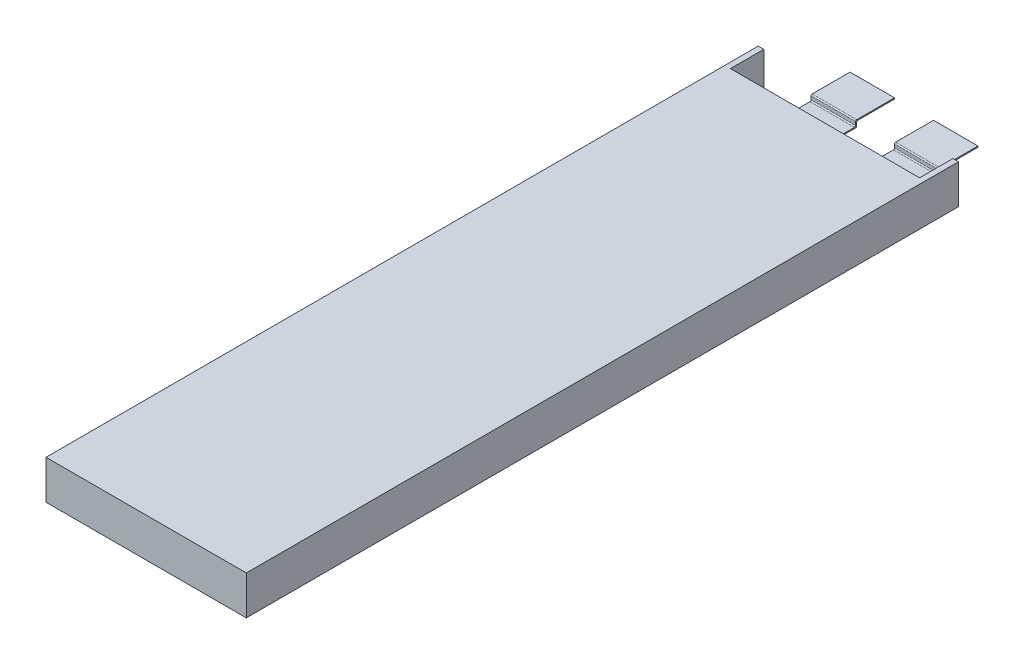
ISO-10303-21;
HEADER;
FILE_DESCRIPTION(('STEP AP214'),'2;1');
FILE_NAME('part.step','',(''),(''),'','','');
FILE_SCHEMA(('AUTOMOTIVE_DESIGN { 1 0 10303 214 1 1 1 1 }'));
ENDSEC;
DATA;
#1=APPLICATION_CONTEXT('core data for automotive mechanical design processes');
#2=APPLICATION_PROTOCOL_DEFINITION('international standard','automotive_design',2000,#1);
#3=PRODUCT_CONTEXT('',#1,'mechanical');
#4=PRODUCT('Part','Part','',(#3));
#5=PRODUCT_RELATED_PRODUCT_CATEGORY('part','',(#4));
#6=PRODUCT_DEFINITION_FORMATION('','',#4);
#7=PRODUCT_DEFINITION_CONTEXT('part definition',#1,'design');
#8=PRODUCT_DEFINITION('design','',#6,#7);
#9=PRODUCT_DEFINITION_SHAPE('','',#8);
#10=(LENGTH_UNIT() NAMED_UNIT(*) SI_UNIT(.MILLI.,.METRE.));
#11=(NAMED_UNIT(*) PLANE_ANGLE_UNIT() SI_UNIT($,.RADIAN.));
#12=(NAMED_UNIT(*) SI_UNIT($,.STERADIAN.) SOLID_ANGLE_UNIT());
#13=UNCERTAINTY_MEASURE_WITH_UNIT(LENGTH_MEASURE(1.E-05),#10,'distance_accuracy_value','');
#14=(GEOMETRIC_REPRESENTATION_CONTEXT(3) GLOBAL_UNCERTAINTY_ASSIGNED_CONTEXT((#13)) GLOBAL_UNIT_ASSIGNED_CONTEXT((#10,
#11,#12)) REPRESENTATION_CONTEXT('',''));
#15=CARTESIAN_POINT('',(0.,0.,0.));
#16=DIRECTION('',(0.,0.,1.));
#17=DIRECTION('',(1.,0.,0.));
#18=AXIS2_PLACEMENT_3D('',#15,#16,#17);
#19=CARTESIAN_POINT('',(0.,1.,0.));
#20=DIRECTION('',(0.,-1.,0.));
#21=DIRECTION('',(0.,0.,-1.));
#22=AXIS2_PLACEMENT_3D('',#19,#20,#21);
#23=PLANE('',#22);
#24=DIRECTION('',(-1.,0.,0.));
#25=VECTOR('',#24,1.);
#26=CARTESIAN_POINT('',(18.,1.,-58.));
#27=LINE('',#26,#25);
#28=CARTESIAN_POINT('',(17.,1.,-58.));
#29=VERTEX_POINT('',#28);
#30=CARTESIAN_POINT('',(-17.,1.,-58.));
#31=VERTEX_POINT('',#30);
#32=EDGE_CURVE('E527',#29,#31,#27,.T.);
#33=ORIENTED_EDGE('',*,*,#32,.F.);
#34=DIRECTION('',(0.,0.,-1.));
#35=VECTOR('',#34,1.);
#36=CARTESIAN_POINT('',(17.,1.,-64.));
#37=LINE('',#36,#35);
#38=CARTESIAN_POINT('',(17.,1.,-64.));
#39=VERTEX_POINT('',#38);
#40=EDGE_CURVE('E260',#29,#39,#37,.T.);
#41=ORIENTED_EDGE('',*,*,#40,.T.);
#42=DIRECTION('',(-1.,0.,0.));
#43=VECTOR('',#42,1.);
#44=CARTESIAN_POINT('',(18.,1.,-64.));
#45=LINE('',#44,#43);
#46=CARTESIAN_POINT('',(-17.,1.,-64.));
#47=VERTEX_POINT('',#46);
#48=EDGE_CURVE('E561',#39,#47,#45,.T.);
#49=ORIENTED_EDGE('',*,*,#48,.T.);
#50=DIRECTION('',(0.,0.,-1.));
#51=VECTOR('',#50,1.);
#52=CARTESIAN_POINT('',(-17.,1.,-64.));
#53=LINE('',#52,#51);
#54=EDGE_CURVE('E522',#31,#47,#53,.T.);
#55=ORIENTED_EDGE('',*,*,#54,.F.);
#56=EDGE_LOOP('',(#33,#41,#49,#55));
#57=FACE_BOUND('',#56,.T.);
#58=ADVANCED_FACE('F39',(#57),#23,.F.);
#59=CARTESIAN_POINT('',(18.,7.,-58.));
#60=DIRECTION('',(0.,0.,1.));
#61=DIRECTION('',(1.,0.,0.));
#62=AXIS2_PLACEMENT_3D('',#59,#60,#61);
#63=PLANE('',#62);
#64=DIRECTION('',(-1.,0.,0.));
#65=VECTOR('',#64,1.);
#66=CARTESIAN_POINT('',(18.,7.,-58.));
#67=LINE('',#66,#65);
#68=CARTESIAN_POINT('',(17.,7.,-58.));
#69=VERTEX_POINT('',#68);
#70=CARTESIAN_POINT('',(-17.,7.,-58.));
#71=VERTEX_POINT('',#70);
#72=EDGE_CURVE('E555',#69,#71,#67,.T.);
#73=ORIENTED_EDGE('',*,*,#72,.F.);
#74=DIRECTION('',(0.,-1.,0.));
#75=VECTOR('',#74,1.);
#76=CARTESIAN_POINT('',(17.,13.0827625302982,-58.));
#77=LINE('',#76,#75);
#78=EDGE_CURVE('E397',#69,#29,#77,.T.);
#79=ORIENTED_EDGE('',*,*,#78,.T.);
#80=ORIENTED_EDGE('',*,*,#32,.T.);
#81=DIRECTION('',(0.,-1.,0.));
#82=VECTOR('',#81,1.);
#83=CARTESIAN_POINT('',(-17.,13.0827625302982,-58.));
#84=LINE('',#83,#82);
#85=EDGE_CURVE('E536',#71,#31,#84,.T.);
#86=ORIENTED_EDGE('',*,*,#85,.F.);
#87=EDGE_LOOP('',(#73,#79,#80,#86));
#88=FACE_BOUND('',#87,.T.);
#89=ADVANCED_FACE('F655',(#88),#63,.F.);
#90=CARTESIAN_POINT('',(-18.,1.,-64.));
#91=DIRECTION('',(1.,0.,0.));
#92=DIRECTION('',(0.,0.,-1.));
#93=AXIS2_PLACEMENT_3D('',#90,#91,#92);
#94=PLANE('',#93);
#95=DIRECTION('',(0.,0.,1.));
#96=VECTOR('',#95,1.);
#97=CARTESIAN_POINT('',(-18.,0.,-64.));
#98=LINE('',#97,#96);
#99=CARTESIAN_POINT('',(-18.,0.,-64.));
#100=VERTEX_POINT('',#99);
#101=CARTESIAN_POINT('',(-18.,0.,64.));
#102=VERTEX_POINT('',#101);
#103=EDGE_CURVE('E558',#100,#102,#98,.T.);
#104=ORIENTED_EDGE('',*,*,#103,.T.);
#105=DIRECTION('',(0.,-1.,0.));
#106=VECTOR('',#105,1.);
#107=CARTESIAN_POINT('',(-18.,1.,64.));
#108=LINE('',#107,#106);
#109=CARTESIAN_POINT('',(-18.,7.,64.));
#110=VERTEX_POINT('',#109);
#111=EDGE_CURVE('E11',#110,#102,#108,.T.);
#112=ORIENTED_EDGE('',*,*,#111,.F.);
#113=DIRECTION('',(0.,0.,1.));
#114=VECTOR('',#113,1.);
#115=CARTESIAN_POINT('',(-18.,7.,-58.));
#116=LINE('',#115,#114);
#117=CARTESIAN_POINT('',(-18.,7.,-64.));
#118=VERTEX_POINT('',#117);
#119=EDGE_CURVE('E543',#118,#110,#116,.T.);
#120=ORIENTED_EDGE('',*,*,#119,.F.);
#121=DIRECTION('',(0.,-1.,0.));
#122=VECTOR('',#121,1.);
#123=CARTESIAN_POINT('',(-18.,1.,-64.));
#124=LINE('',#123,#122);
#125=EDGE_CURVE('E564',#118,#100,#124,.T.);
#126=ORIENTED_EDGE('',*,*,#125,.T.);
#127=EDGE_LOOP('',(#104,#112,#120,#126));
#128=FACE_BOUND('',#127,.T.);
#129=ADVANCED_FACE('F41',(#128),#94,.F.);
#130=CARTESIAN_POINT('',(18.,1.,64.));
#131=DIRECTION('',(0.,0.,-1.));
#132=DIRECTION('',(-1.,0.,0.));
#133=AXIS2_PLACEMENT_3D('',#130,#131,#132);
#134=PLANE('',#133);
#135=DIRECTION('',(1.,0.,0.));
#136=VECTOR('',#135,1.);
#137=CARTESIAN_POINT('',(18.,0.,64.));
#138=LINE('',#137,#136);
#139=CARTESIAN_POINT('',(18.,0.,64.));
#140=VERTEX_POINT('',#139);
#141=EDGE_CURVE('E569',#102,#140,#138,.T.);
#142=ORIENTED_EDGE('',*,*,#141,.T.);
#143=DIRECTION('',(0.,-1.,0.));
#144=VECTOR('',#143,1.);
#145=CARTESIAN_POINT('',(18.,1.,64.));
#146=LINE('',#145,#144);
#147=CARTESIAN_POINT('',(18.,7.,64.));
#148=VERTEX_POINT('',#147);
#149=EDGE_CURVE('E48',#148,#140,#146,.T.);
#150=ORIENTED_EDGE('',*,*,#149,.F.);
#151=DIRECTION('',(1.,0.,0.));
#152=VECTOR('',#151,1.);
#153=CARTESIAN_POINT('',(18.,7.,64.));
#154=LINE('',#153,#152);
#155=EDGE_CURVE('E547',#110,#148,#154,.T.);
#156=ORIENTED_EDGE('',*,*,#155,.F.);
#157=ORIENTED_EDGE('',*,*,#111,.T.);
#158=EDGE_LOOP('',(#142,#150,#156,#157));
#159=FACE_BOUND('',#158,.T.);
#160=ADVANCED_FACE('F609',(#159),#134,.F.);
#161=CARTESIAN_POINT('',(18.,1.,-64.));
#162=DIRECTION('',(-1.,0.,0.));
#163=DIRECTION('',(0.,0.,1.));
#164=AXIS2_PLACEMENT_3D('',#161,#162,#163);
#165=PLANE('',#164);
#166=DIRECTION('',(0.,0.,-1.));
#167=VECTOR('',#166,1.);
#168=CARTESIAN_POINT('',(18.,0.,-64.));
#169=LINE('',#168,#167);
#170=CARTESIAN_POINT('',(18.,0.,-64.));
#171=VERTEX_POINT('',#170);
#172=EDGE_CURVE('E572',#140,#171,#169,.T.);
#173=ORIENTED_EDGE('',*,*,#172,.T.);
#174=DIRECTION('',(0.,-1.,0.));
#175=VECTOR('',#174,1.);
#176=CARTESIAN_POINT('',(18.,1.,-64.));
#177=LINE('',#176,#175);
#178=CARTESIAN_POINT('',(18.,7.,-64.));
#179=VERTEX_POINT('',#178);
#180=EDGE_CURVE('E583',#179,#171,#177,.T.);
#181=ORIENTED_EDGE('',*,*,#180,.F.);
#182=DIRECTION('',(0.,0.,-1.));
#183=VECTOR('',#182,1.);
#184=CARTESIAN_POINT('',(18.,7.,-58.));
#185=LINE('',#184,#183);
#186=EDGE_CURVE('E551',#148,#179,#185,.T.);
#187=ORIENTED_EDGE('',*,*,#186,.F.);
#188=ORIENTED_EDGE('',*,*,#149,.T.);
#189=EDGE_LOOP('',(#173,#181,#187,#188));
#190=FACE_BOUND('',#189,.T.);
#191=ADVANCED_FACE('F591',(#190),#165,.F.);
#192=CARTESIAN_POINT('',(18.,1.,-64.));
#193=DIRECTION('',(0.,0.,1.));
#194=DIRECTION('',(1.,0.,0.));
#195=AXIS2_PLACEMENT_3D('',#192,#193,#194);
#196=PLANE('',#195);
#197=DIRECTION('',(1.,0.,0.));
#198=VECTOR('',#197,1.);
#199=CARTESIAN_POINT('',(-11.5,0.2,-64.));
#200=LINE('',#199,#198);
#201=CARTESIAN_POINT('',(-11.5,0.2,-64.));
#202=VERTEX_POINT('',#201);
#203=CARTESIAN_POINT('',(-3.5,0.199999999999999,-64.));
#204=VERTEX_POINT('',#203);
#205=EDGE_CURVE('E55',#202,#204,#200,.T.);
#206=ORIENTED_EDGE('',*,*,#205,.F.);
#207=DIRECTION('',(0.,-1.,0.));
#208=VECTOR('',#207,1.);
#209=CARTESIAN_POINT('',(-11.5,0.,-64.));
#210=LINE('',#209,#208);
#211=CARTESIAN_POINT('',(-11.5,0.,-64.));
#212=VERTEX_POINT('',#211);
#213=EDGE_CURVE('E294',#202,#212,#210,.T.);
#214=ORIENTED_EDGE('',*,*,#213,.T.);
#215=DIRECTION('',(-1.,0.,0.));
#216=VECTOR('',#215,1.);
#217=CARTESIAN_POINT('',(18.,0.,-64.));
#218=LINE('',#217,#216);
#219=EDGE_CURVE('E575',#212,#100,#218,.T.);
#220=ORIENTED_EDGE('',*,*,#219,.T.);
#221=ORIENTED_EDGE('',*,*,#125,.F.);
#222=DIRECTION('',(1.,0.,0.));
#223=VECTOR('',#222,1.);
#224=CARTESIAN_POINT('',(-18.,7.,-64.));
#225=LINE('',#224,#223);
#226=CARTESIAN_POINT('',(-17.,7.,-64.));
#227=VERTEX_POINT('',#226);
#228=EDGE_CURVE('E528',#118,#227,#225,.T.);
#229=ORIENTED_EDGE('',*,*,#228,.T.);
#230=DIRECTION('',(0.,-1.,0.));
#231=VECTOR('',#230,1.);
#232=CARTESIAN_POINT('',(-17.,13.0827625302982,-64.));
#233=LINE('',#232,#231);
#234=EDGE_CURVE('E532',#227,#47,#233,.T.);
#235=ORIENTED_EDGE('',*,*,#234,.T.);
#236=ORIENTED_EDGE('',*,*,#48,.F.);
#237=DIRECTION('',(0.,-1.,0.));
#238=VECTOR('',#237,1.);
#239=CARTESIAN_POINT('',(17.,13.0827625302982,-64.));
#240=LINE('',#239,#238);
#241=CARTESIAN_POINT('',(17.,7.,-64.));
#242=VERTEX_POINT('',#241);
#243=EDGE_CURVE('E390',#242,#39,#240,.T.);
#244=ORIENTED_EDGE('',*,*,#243,.F.);
#245=DIRECTION('',(-1.,0.,0.));
#246=VECTOR('',#245,1.);
#247=CARTESIAN_POINT('',(18.,7.,-64.));
#248=LINE('',#247,#246);
#249=EDGE_CURVE('E389',#179,#242,#248,.T.);
#250=ORIENTED_EDGE('',*,*,#249,.F.);
#251=ORIENTED_EDGE('',*,*,#180,.T.);
#252=CARTESIAN_POINT('',(11.5,0.,-64.));
#253=VERTEX_POINT('',#252);
#254=EDGE_CURVE('E565',#171,#253,#218,.T.);
#255=ORIENTED_EDGE('',*,*,#254,.T.);
#256=DIRECTION('',(0.,-1.,0.));
#257=VECTOR('',#256,1.);
#258=CARTESIAN_POINT('',(11.5,0.,-64.));
#259=LINE('',#258,#257);
#260=CARTESIAN_POINT('',(11.5,0.2,-64.));
#261=VERTEX_POINT('',#260);
#262=EDGE_CURVE('E423',#261,#253,#259,.T.);
#263=ORIENTED_EDGE('',*,*,#262,.F.);
#264=DIRECTION('',(-1.,0.,0.));
#265=VECTOR('',#264,1.);
#266=CARTESIAN_POINT('',(11.5,0.2,-64.));
#267=LINE('',#266,#265);
#268=CARTESIAN_POINT('',(3.5,0.2,-64.));
#269=VERTEX_POINT('',#268);
#270=EDGE_CURVE('E498',#261,#269,#267,.T.);
#271=ORIENTED_EDGE('',*,*,#270,.T.);
#272=DIRECTION('',(0.,-1.,0.));
#273=VECTOR('',#272,1.);
#274=CARTESIAN_POINT('',(3.5,0.,-64.));
#275=LINE('',#274,#273);
#276=CARTESIAN_POINT('',(3.5,0.,-64.));
#277=VERTEX_POINT('',#276);
#278=EDGE_CURVE('E461',#269,#277,#275,.T.);
#279=ORIENTED_EDGE('',*,*,#278,.T.);
#280=CARTESIAN_POINT('',(-3.5,0.,-64.));
#281=VERTEX_POINT('',#280);
#282=EDGE_CURVE('E579',#277,#281,#218,.T.);
#283=ORIENTED_EDGE('',*,*,#282,.T.);
#284=DIRECTION('',(0.,-1.,0.));
#285=VECTOR('',#284,1.);
#286=CARTESIAN_POINT('',(-3.5,0.,-64.));
#287=LINE('',#286,#285);
#288=EDGE_CURVE('E60',#204,#281,#287,.T.);
#289=ORIENTED_EDGE('',*,*,#288,.F.);
#290=EDGE_LOOP('',(#206,#214,#220,#221,#229,#235,#236,#244,#250,#251,#255,#263,#271,#279,#283,#289));
#291=FACE_BOUND('',#290,.T.);
#292=ADVANCED_FACE('F601',(#291),#196,.F.);
#293=CARTESIAN_POINT('',(0.,0.,0.));
#294=DIRECTION('',(0.,-1.,0.));
#295=DIRECTION('',(0.,0.,-1.));
#296=AXIS2_PLACEMENT_3D('',#293,#294,#295);
#297=PLANE('',#296);
#298=ORIENTED_EDGE('',*,*,#103,.F.);
#299=ORIENTED_EDGE('',*,*,#219,.F.);
#300=DIRECTION('',(0.,0.,-1.));
#301=VECTOR('',#300,1.);
#302=CARTESIAN_POINT('',(-11.5,0.,-64.));
#303=LINE('',#302,#301);
#304=CARTESIAN_POINT('',(-11.5,0.,-67.));
#305=VERTEX_POINT('',#304);
#306=EDGE_CURVE('E290',#212,#305,#303,.T.);
#307=ORIENTED_EDGE('',*,*,#306,.T.);
#308=DIRECTION('',(1.,0.,0.));
#309=VECTOR('',#308,1.);
#310=CARTESIAN_POINT('',(-11.5,0.,-67.));
#311=LINE('',#310,#309);
#312=CARTESIAN_POINT('',(-3.5,0.,-67.));
#313=VERTEX_POINT('',#312);
#314=EDGE_CURVE('E374',#305,#313,#311,.T.);
#315=ORIENTED_EDGE('',*,*,#314,.T.);
#316=DIRECTION('',(0.,0.,-1.));
#317=VECTOR('',#316,1.);
#318=CARTESIAN_POINT('',(-3.5,0.,-64.));
#319=LINE('',#318,#317);
#320=EDGE_CURVE('E333',#281,#313,#319,.T.);
#321=ORIENTED_EDGE('',*,*,#320,.F.);
#322=ORIENTED_EDGE('',*,*,#282,.F.);
#323=DIRECTION('',(0.,0.,-1.));
#324=VECTOR('',#323,1.);
#325=CARTESIAN_POINT('',(3.5,0.,-64.));
#326=LINE('',#325,#324);
#327=CARTESIAN_POINT('',(3.5,0.,-67.));
#328=VERTEX_POINT('',#327);
#329=EDGE_CURVE('E465',#277,#328,#326,.T.);
#330=ORIENTED_EDGE('',*,*,#329,.T.);
#331=DIRECTION('',(-1.,0.,0.));
#332=VECTOR('',#331,1.);
#333=CARTESIAN_POINT('',(11.5,0.,-67.));
#334=LINE('',#333,#332);
#335=CARTESIAN_POINT('',(11.5,0.,-67.));
#336=VERTEX_POINT('',#335);
#337=EDGE_CURVE('E494',#336,#328,#334,.T.);
#338=ORIENTED_EDGE('',*,*,#337,.F.);
#339=DIRECTION('',(0.,0.,-1.));
#340=VECTOR('',#339,1.);
#341=CARTESIAN_POINT('',(11.5,0.,-64.));
#342=LINE('',#341,#340);
#343=EDGE_CURVE('E426',#253,#336,#342,.T.);
#344=ORIENTED_EDGE('',*,*,#343,.F.);
#345=ORIENTED_EDGE('',*,*,#254,.F.);
#346=ORIENTED_EDGE('',*,*,#172,.F.);
#347=ORIENTED_EDGE('',*,*,#141,.F.);
#348=EDGE_LOOP('',(#298,#299,#307,#315,#321,#322,#330,#338,#344,#345,#346,#347));
#349=FACE_BOUND('',#348,.T.);
#350=ADVANCED_FACE('F597',(#349),#297,.T.);
#351=CARTESIAN_POINT('',(0.,7.,0.));
#352=DIRECTION('',(0.,-1.,0.));
#353=DIRECTION('',(0.,0.,-1.));
#354=AXIS2_PLACEMENT_3D('',#351,#352,#353);
#355=PLANE('',#354);
#356=ORIENTED_EDGE('',*,*,#119,.T.);
#357=ORIENTED_EDGE('',*,*,#155,.T.);
#358=ORIENTED_EDGE('',*,*,#186,.T.);
#359=ORIENTED_EDGE('',*,*,#249,.T.);
#360=DIRECTION('',(0.,0.,1.));
#361=VECTOR('',#360,1.);
#362=CARTESIAN_POINT('',(17.,7.,-64.));
#363=LINE('',#362,#361);
#364=EDGE_CURVE('E385',#242,#69,#363,.T.);
#365=ORIENTED_EDGE('',*,*,#364,.T.);
#366=ORIENTED_EDGE('',*,*,#72,.T.);
#367=DIRECTION('',(0.,0.,1.));
#368=VECTOR('',#367,1.);
#369=CARTESIAN_POINT('',(-17.,7.,-64.));
#370=LINE('',#369,#368);
#371=EDGE_CURVE('E523',#227,#71,#370,.T.);
#372=ORIENTED_EDGE('',*,*,#371,.F.);
#373=ORIENTED_EDGE('',*,*,#228,.F.);
#374=EDGE_LOOP('',(#356,#357,#358,#359,#365,#366,#372,#373));
#375=FACE_BOUND('',#374,.T.);
#376=ADVANCED_FACE('F605',(#375),#355,.F.);
#377=CARTESIAN_POINT('',(-17.,13.0827625302982,-64.));
#378=DIRECTION('',(-1.,0.,0.));
#379=DIRECTION('',(0.,0.,1.));
#380=AXIS2_PLACEMENT_3D('',#377,#378,#379);
#381=PLANE('',#380);
#382=ORIENTED_EDGE('',*,*,#234,.F.);
#383=ORIENTED_EDGE('',*,*,#371,.T.);
#384=ORIENTED_EDGE('',*,*,#85,.T.);
#385=ORIENTED_EDGE('',*,*,#54,.T.);
#386=EDGE_LOOP('',(#382,#383,#384,#385));
#387=FACE_BOUND('',#386,.T.);
#388=ADVANCED_FACE('F719',(#387),#381,.F.);
#389=CARTESIAN_POINT('',(11.5,1.2,-74.));
#390=DIRECTION('',(0.,0.,1.));
#391=DIRECTION('',(1.,0.,0.));
#392=AXIS2_PLACEMENT_3D('',#389,#390,#391);
#393=PLANE('',#392);
#394=DIRECTION('',(0.,1.,0.));
#395=VECTOR('',#394,1.);
#396=CARTESIAN_POINT('',(3.5,1.2,-74.));
#397=LINE('',#396,#395);
#398=CARTESIAN_POINT('',(3.5,1.,-74.));
#399=VERTEX_POINT('',#398);
#400=CARTESIAN_POINT('',(3.5,1.2,-74.));
#401=VERTEX_POINT('',#400);
#402=EDGE_CURVE('E393',#399,#401,#397,.T.);
#403=ORIENTED_EDGE('',*,*,#402,.T.);
#404=DIRECTION('',(-1.,0.,0.));
#405=VECTOR('',#404,1.);
#406=CARTESIAN_POINT('',(11.5,1.2,-74.));
#407=LINE('',#406,#405);
#408=CARTESIAN_POINT('',(11.5,1.2,-74.));
#409=VERTEX_POINT('',#408);
#410=EDGE_CURVE('E518',#409,#401,#407,.T.);
#411=ORIENTED_EDGE('',*,*,#410,.F.);
#412=DIRECTION('',(0.,1.,0.));
#413=VECTOR('',#412,1.);
#414=CARTESIAN_POINT('',(11.5,1.2,-74.));
#415=LINE('',#414,#413);
#416=CARTESIAN_POINT('',(11.5,1.,-74.));
#417=VERTEX_POINT('',#416);
#418=EDGE_CURVE('E403',#417,#409,#415,.T.);
#419=ORIENTED_EDGE('',*,*,#418,.F.);
#420=DIRECTION('',(-1.,0.,0.));
#421=VECTOR('',#420,1.);
#422=CARTESIAN_POINT('',(11.5,1.,-74.));
#423=LINE('',#422,#421);
#424=EDGE_CURVE('E441',#417,#399,#423,.T.);
#425=ORIENTED_EDGE('',*,*,#424,.T.);
#426=EDGE_LOOP('',(#403,#411,#419,#425));
#427=FACE_BOUND('',#426,.T.);
#428=ADVANCED_FACE('F864',(#427),#393,.F.);
#429=CARTESIAN_POINT('',(11.5,1.2,-67.2));
#430=DIRECTION('',(0.,-1.,0.));
#431=DIRECTION('',(0.,0.,-1.));
#432=AXIS2_PLACEMENT_3D('',#429,#430,#431);
#433=PLANE('',#432);
#434=DIRECTION('',(0.,0.,1.));
#435=VECTOR('',#434,1.);
#436=CARTESIAN_POINT('',(3.5,1.2,-67.2));
#437=LINE('',#436,#435);
#438=CARTESIAN_POINT('',(3.5,1.2,-67.2));
#439=VERTEX_POINT('',#438);
#440=EDGE_CURVE('E445',#401,#439,#437,.T.);
#441=ORIENTED_EDGE('',*,*,#440,.T.);
#442=DIRECTION('',(-1.,0.,0.));
#443=VECTOR('',#442,1.);
#444=CARTESIAN_POINT('',(11.5,1.2,-67.2));
#445=LINE('',#444,#443);
#446=CARTESIAN_POINT('',(11.5,1.2,-67.2));
#447=VERTEX_POINT('',#446);
#448=EDGE_CURVE('E514',#447,#439,#445,.T.);
#449=ORIENTED_EDGE('',*,*,#448,.F.);
#450=DIRECTION('',(0.,0.,1.));
#451=VECTOR('',#450,1.);
#452=CARTESIAN_POINT('',(11.5,1.2,-67.2));
#453=LINE('',#452,#451);
#454=EDGE_CURVE('E407',#409,#447,#453,.T.);
#455=ORIENTED_EDGE('',*,*,#454,.F.);
#456=ORIENTED_EDGE('',*,*,#410,.T.);
#457=EDGE_LOOP('',(#441,#449,#455,#456));
#458=FACE_BOUND('',#457,.T.);
#459=ADVANCED_FACE('F860',(#458),#433,.F.);
#460=CARTESIAN_POINT('',(11.5,1.,-67.2));
#461=DIRECTION('',(-1.,0.,0.));
#462=DIRECTION('',(0.,0.,1.));
#463=AXIS2_PLACEMENT_3D('',#460,#461,#462);
#464=CYLINDRICAL_SURFACE('',#463,0.200000000000003);
#465=CARTESIAN_POINT('',(3.5,1.,-67.2));
#466=DIRECTION('',(1.,0.,0.));
#467=DIRECTION('',(0.,0.,-1.));
#468=AXIS2_PLACEMENT_3D('',#465,#466,#467);
#469=CIRCLE('',#468,0.200000000000003);
#470=CARTESIAN_POINT('',(3.5,1.,-67.));
#471=VERTEX_POINT('',#470);
#472=EDGE_CURVE('E448',#439,#471,#469,.T.);
#473=ORIENTED_EDGE('',*,*,#472,.T.);
#474=DIRECTION('',(-1.,0.,0.));
#475=VECTOR('',#474,1.);
#476=CARTESIAN_POINT('',(11.5,1.,-67.));
#477=LINE('',#476,#475);
#478=CARTESIAN_POINT('',(11.5,1.,-67.));
#479=VERTEX_POINT('',#478);
#480=EDGE_CURVE('E510',#479,#471,#477,.T.);
#481=ORIENTED_EDGE('',*,*,#480,.F.);
#482=CARTESIAN_POINT('',(11.5,1.,-67.2));
#483=DIRECTION('',(1.,0.,0.));
#484=DIRECTION('',(0.,0.,-1.));
#485=AXIS2_PLACEMENT_3D('',#482,#483,#484);
#486=CIRCLE('',#485,0.200000000000003);
#487=EDGE_CURVE('E411',#447,#479,#486,.T.);
#488=ORIENTED_EDGE('',*,*,#487,.F.);
#489=ORIENTED_EDGE('',*,*,#448,.T.);
#490=EDGE_LOOP('',(#473,#481,#488,#489));
#491=FACE_BOUND('',#490,.T.);
#492=ADVANCED_FACE('F856',(#491),#464,.T.);
#493=CARTESIAN_POINT('',(11.5,1.,-67.));
#494=DIRECTION('',(0.,0.,-1.));
#495=DIRECTION('',(-1.,0.,0.));
#496=AXIS2_PLACEMENT_3D('',#493,#494,#495);
#497=PLANE('',#496);
#498=DIRECTION('',(0.,-1.,0.));
#499=VECTOR('',#498,1.);
#500=CARTESIAN_POINT('',(3.5,1.,-67.));
#501=LINE('',#500,#499);
#502=CARTESIAN_POINT('',(3.5,0.4,-67.));
#503=VERTEX_POINT('',#502);
#504=EDGE_CURVE('E451',#471,#503,#501,.T.);
#505=ORIENTED_EDGE('',*,*,#504,.T.);
#506=DIRECTION('',(-1.,0.,0.));
#507=VECTOR('',#506,1.);
#508=CARTESIAN_POINT('',(11.5,0.4,-67.));
#509=LINE('',#508,#507);
#510=CARTESIAN_POINT('',(11.5,0.4,-67.));
#511=VERTEX_POINT('',#510);
#512=EDGE_CURVE('E506',#511,#503,#509,.T.);
#513=ORIENTED_EDGE('',*,*,#512,.F.);
#514=DIRECTION('',(0.,-1.,0.));
#515=VECTOR('',#514,1.);
#516=CARTESIAN_POINT('',(11.5,1.,-67.));
#517=LINE('',#516,#515);
#518=EDGE_CURVE('E414',#479,#511,#517,.T.);
#519=ORIENTED_EDGE('',*,*,#518,.F.);
#520=ORIENTED_EDGE('',*,*,#480,.T.);
#521=EDGE_LOOP('',(#505,#513,#519,#520));
#522=FACE_BOUND('',#521,.T.);
#523=ADVANCED_FACE('F852',(#522),#497,.F.);
#524=CARTESIAN_POINT('',(11.5,0.4,-66.8));
#525=DIRECTION('',(-1.,0.,0.));
#526=DIRECTION('',(0.,0.,1.));
#527=AXIS2_PLACEMENT_3D('',#524,#525,#526);
#528=CYLINDRICAL_SURFACE('',#527,0.200000000000003);
#529=CARTESIAN_POINT('',(3.5,0.4,-66.8));
#530=DIRECTION('',(-1.,0.,0.));
#531=DIRECTION('',(0.,0.,-1.));
#532=AXIS2_PLACEMENT_3D('',#529,#530,#531);
#533=CIRCLE('',#532,0.200000000000003);
#534=CARTESIAN_POINT('',(3.5,0.199999999999997,-66.8));
#535=VERTEX_POINT('',#534);
#536=EDGE_CURVE('E454',#503,#535,#533,.T.);
#537=ORIENTED_EDGE('',*,*,#536,.T.);
#538=DIRECTION('',(-1.,0.,0.));
#539=VECTOR('',#538,1.);
#540=CARTESIAN_POINT('',(11.5,0.199999999999997,-66.8));
#541=LINE('',#540,#539);
#542=CARTESIAN_POINT('',(11.5,0.199999999999997,-66.8));
#543=VERTEX_POINT('',#542);
#544=EDGE_CURVE('E502',#543,#535,#541,.T.);
#545=ORIENTED_EDGE('',*,*,#544,.F.);
#546=CARTESIAN_POINT('',(11.5,0.4,-66.8));
#547=DIRECTION('',(-1.,0.,0.));
#548=DIRECTION('',(0.,0.,-1.));
#549=AXIS2_PLACEMENT_3D('',#546,#547,#548);
#550=CIRCLE('',#549,0.200000000000003);
#551=EDGE_CURVE('E417',#511,#543,#550,.T.);
#552=ORIENTED_EDGE('',*,*,#551,.F.);
#553=ORIENTED_EDGE('',*,*,#512,.T.);
#554=EDGE_LOOP('',(#537,#545,#552,#553));
#555=FACE_BOUND('',#554,.T.);
#556=ADVANCED_FACE('F848',(#555),#528,.F.);
#557=CARTESIAN_POINT('',(11.5,0.2,-64.));
#558=DIRECTION('',(0.,-1.,0.));
#559=DIRECTION('',(0.,0.,-1.));
#560=AXIS2_PLACEMENT_3D('',#557,#558,#559);
#561=PLANE('',#560);
#562=DIRECTION('',(0.,0.,1.));
#563=VECTOR('',#562,1.);
#564=CARTESIAN_POINT('',(3.5,0.2,-64.));
#565=LINE('',#564,#563);
#566=EDGE_CURVE('E457',#535,#269,#565,.T.);
#567=ORIENTED_EDGE('',*,*,#566,.T.);
#568=ORIENTED_EDGE('',*,*,#270,.F.);
#569=DIRECTION('',(0.,0.,1.));
#570=VECTOR('',#569,1.);
#571=CARTESIAN_POINT('',(11.5,0.2,-64.));
#572=LINE('',#571,#570);
#573=EDGE_CURVE('E420',#543,#261,#572,.T.);
#574=ORIENTED_EDGE('',*,*,#573,.F.);
#575=ORIENTED_EDGE('',*,*,#544,.T.);
#576=EDGE_LOOP('',(#567,#568,#574,#575));
#577=FACE_BOUND('',#576,.T.);
#578=ADVANCED_FACE('F844',(#577),#561,.F.);
#579=CARTESIAN_POINT('',(11.5,0.2,-67.));
#580=DIRECTION('',(-1.,0.,0.));
#581=DIRECTION('',(0.,0.,1.));
#582=AXIS2_PLACEMENT_3D('',#579,#580,#581);
#583=CYLINDRICAL_SURFACE('',#582,0.200000000000003);
#584=CARTESIAN_POINT('',(3.5,0.2,-67.));
#585=DIRECTION('',(1.,0.,0.));
#586=DIRECTION('',(0.,0.,-1.));
#587=AXIS2_PLACEMENT_3D('',#584,#585,#586);
#588=CIRCLE('',#587,0.200000000000003);
#589=CARTESIAN_POINT('',(3.5,0.2,-67.2));
#590=VERTEX_POINT('',#589);
#591=EDGE_CURVE('E468',#328,#590,#588,.T.);
#592=ORIENTED_EDGE('',*,*,#591,.T.);
#593=DIRECTION('',(-1.,0.,0.));
#594=VECTOR('',#593,1.);
#595=CARTESIAN_POINT('',(11.5,0.2,-67.2));
#596=LINE('',#595,#594);
#597=CARTESIAN_POINT('',(11.5,0.2,-67.2));
#598=VERTEX_POINT('',#597);
#599=EDGE_CURVE('E490',#598,#590,#596,.T.);
#600=ORIENTED_EDGE('',*,*,#599,.F.);
#601=CARTESIAN_POINT('',(11.5,0.2,-67.));
#602=DIRECTION('',(1.,0.,0.));
#603=DIRECTION('',(0.,0.,-1.));
#604=AXIS2_PLACEMENT_3D('',#601,#602,#603);
#605=CIRCLE('',#604,0.200000000000003);
#606=EDGE_CURVE('E429',#336,#598,#605,.T.);
#607=ORIENTED_EDGE('',*,*,#606,.F.);
#608=ORIENTED_EDGE('',*,*,#337,.T.);
#609=EDGE_LOOP('',(#592,#600,#607,#608));
#610=FACE_BOUND('',#609,.T.);
#611=ADVANCED_FACE('F840',(#610),#583,.T.);
#612=CARTESIAN_POINT('',(11.5,0.799999999999999,-67.2));
#613=DIRECTION('',(0.,0.,1.));
#614=DIRECTION('',(1.,0.,0.));
#615=AXIS2_PLACEMENT_3D('',#612,#613,#614);
#616=PLANE('',#615);
#617=DIRECTION('',(0.,1.,0.));
#618=VECTOR('',#617,1.);
#619=CARTESIAN_POINT('',(3.5,0.799999999999999,-67.2));
#620=LINE('',#619,#618);
#621=CARTESIAN_POINT('',(3.5,0.799999999999999,-67.2));
#622=VERTEX_POINT('',#621);
#623=EDGE_CURVE('E471',#590,#622,#620,.T.);
#624=ORIENTED_EDGE('',*,*,#623,.T.);
#625=DIRECTION('',(-1.,0.,0.));
#626=VECTOR('',#625,1.);
#627=CARTESIAN_POINT('',(11.5,0.799999999999999,-67.2));
#628=LINE('',#627,#626);
#629=CARTESIAN_POINT('',(11.5,0.799999999999999,-67.2));
#630=VERTEX_POINT('',#629);
#631=EDGE_CURVE('E486',#630,#622,#628,.T.);
#632=ORIENTED_EDGE('',*,*,#631,.F.);
#633=DIRECTION('',(0.,1.,0.));
#634=VECTOR('',#633,1.);
#635=CARTESIAN_POINT('',(11.5,0.799999999999999,-67.2));
#636=LINE('',#635,#634);
#637=EDGE_CURVE('E432',#598,#630,#636,.T.);
#638=ORIENTED_EDGE('',*,*,#637,.F.);
#639=ORIENTED_EDGE('',*,*,#599,.T.);
#640=EDGE_LOOP('',(#624,#632,#638,#639));
#641=FACE_BOUND('',#640,.T.);
#642=ADVANCED_FACE('F836',(#641),#616,.F.);
#643=CARTESIAN_POINT('',(11.5,0.799999999999999,-67.4));
#644=DIRECTION('',(-1.,0.,0.));
#645=DIRECTION('',(0.,0.,1.));
#646=AXIS2_PLACEMENT_3D('',#643,#644,#645);
#647=CYLINDRICAL_SURFACE('',#646,0.200000000000003);
#648=CARTESIAN_POINT('',(3.5,0.799999999999999,-67.4));
#649=DIRECTION('',(-1.,0.,0.));
#650=DIRECTION('',(0.,0.,-1.));
#651=AXIS2_PLACEMENT_3D('',#648,#649,#650);
#652=CIRCLE('',#651,0.200000000000003);
#653=CARTESIAN_POINT('',(3.5,1.,-67.4));
#654=VERTEX_POINT('',#653);
#655=EDGE_CURVE('E474',#622,#654,#652,.T.);
#656=ORIENTED_EDGE('',*,*,#655,.T.);
#657=DIRECTION('',(-1.,0.,0.));
#658=VECTOR('',#657,1.);
#659=CARTESIAN_POINT('',(11.5,1.,-67.4));
#660=LINE('',#659,#658);
#661=CARTESIAN_POINT('',(11.5,1.,-67.4));
#662=VERTEX_POINT('',#661);
#663=EDGE_CURVE('E482',#662,#654,#660,.T.);
#664=ORIENTED_EDGE('',*,*,#663,.F.);
#665=CARTESIAN_POINT('',(11.5,0.799999999999999,-67.4));
#666=DIRECTION('',(-1.,0.,0.));
#667=DIRECTION('',(0.,0.,-1.));
#668=AXIS2_PLACEMENT_3D('',#665,#666,#667);
#669=CIRCLE('',#668,0.200000000000003);
#670=EDGE_CURVE('E435',#630,#662,#669,.T.);
#671=ORIENTED_EDGE('',*,*,#670,.F.);
#672=ORIENTED_EDGE('',*,*,#631,.T.);
#673=EDGE_LOOP('',(#656,#664,#671,#672));
#674=FACE_BOUND('',#673,.T.);
#675=ADVANCED_FACE('F832',(#674),#647,.F.);
#676=CARTESIAN_POINT('',(11.5,1.,-74.));
#677=DIRECTION('',(0.,1.,0.));
#678=DIRECTION('',(0.,0.,1.));
#679=AXIS2_PLACEMENT_3D('',#676,#677,#678);
#680=PLANE('',#679);
#681=DIRECTION('',(0.,0.,-1.));
#682=VECTOR('',#681,1.);
#683=CARTESIAN_POINT('',(3.5,1.,-74.));
#684=LINE('',#683,#682);
#685=EDGE_CURVE('E408',#654,#399,#684,.T.);
#686=ORIENTED_EDGE('',*,*,#685,.T.);
#687=ORIENTED_EDGE('',*,*,#424,.F.);
#688=DIRECTION('',(0.,0.,-1.));
#689=VECTOR('',#688,1.);
#690=CARTESIAN_POINT('',(11.5,1.,-74.));
#691=LINE('',#690,#689);
#692=EDGE_CURVE('E438',#662,#417,#691,.T.);
#693=ORIENTED_EDGE('',*,*,#692,.F.);
#694=ORIENTED_EDGE('',*,*,#663,.T.);
#695=EDGE_LOOP('',(#686,#687,#693,#694));
#696=FACE_BOUND('',#695,.T.);
#697=ADVANCED_FACE('F826',(#696),#680,.F.);
#698=CARTESIAN_POINT('',(11.5,0.799999999999999,-67.4));
#699=DIRECTION('',(1.,0.,0.));
#700=DIRECTION('',(0.,0.,-1.));
#701=AXIS2_PLACEMENT_3D('',#698,#699,#700);
#702=PLANE('',#701);
#703=ORIENTED_EDGE('',*,*,#418,.T.);
#704=ORIENTED_EDGE('',*,*,#454,.T.);
#705=ORIENTED_EDGE('',*,*,#487,.T.);
#706=ORIENTED_EDGE('',*,*,#518,.T.);
#707=ORIENTED_EDGE('',*,*,#551,.T.);
#708=ORIENTED_EDGE('',*,*,#573,.T.);
#709=ORIENTED_EDGE('',*,*,#262,.T.);
#710=ORIENTED_EDGE('',*,*,#343,.T.);
#711=ORIENTED_EDGE('',*,*,#606,.T.);
#712=ORIENTED_EDGE('',*,*,#637,.T.);
#713=ORIENTED_EDGE('',*,*,#670,.T.);
#714=ORIENTED_EDGE('',*,*,#692,.T.);
#715=EDGE_LOOP('',(#703,#704,#705,#706,#707,#708,#709,#710,#711,#712,#713,#714));
#716=FACE_BOUND('',#715,.T.);
#717=ADVANCED_FACE('F823',(#716),#702,.T.);
#718=CARTESIAN_POINT('',(3.5,0.799999999999999,-67.4));
#719=DIRECTION('',(1.,0.,0.));
#720=DIRECTION('',(0.,0.,-1.));
#721=AXIS2_PLACEMENT_3D('',#718,#719,#720);
#722=PLANE('',#721);
#723=ORIENTED_EDGE('',*,*,#402,.F.);
#724=ORIENTED_EDGE('',*,*,#685,.F.);
#725=ORIENTED_EDGE('',*,*,#655,.F.);
#726=ORIENTED_EDGE('',*,*,#623,.F.);
#727=ORIENTED_EDGE('',*,*,#591,.F.);
#728=ORIENTED_EDGE('',*,*,#329,.F.);
#729=ORIENTED_EDGE('',*,*,#278,.F.);
#730=ORIENTED_EDGE('',*,*,#566,.F.);
#731=ORIENTED_EDGE('',*,*,#536,.F.);
#732=ORIENTED_EDGE('',*,*,#504,.F.);
#733=ORIENTED_EDGE('',*,*,#472,.F.);
#734=ORIENTED_EDGE('',*,*,#440,.F.);
#735=EDGE_LOOP('',(#723,#724,#725,#726,#727,#728,#729,#730,#731,#732,#733,#734));
#736=FACE_BOUND('',#735,.T.);
#737=ADVANCED_FACE('F729',(#736),#722,.F.);
#738=CARTESIAN_POINT('',(17.,13.0827625302982,-64.));
#739=DIRECTION('',(-1.,0.,0.));
#740=DIRECTION('',(0.,0.,1.));
#741=AXIS2_PLACEMENT_3D('',#738,#739,#740);
#742=PLANE('',#741);
#743=ORIENTED_EDGE('',*,*,#364,.F.);
#744=ORIENTED_EDGE('',*,*,#243,.T.);
#745=ORIENTED_EDGE('',*,*,#40,.F.);
#746=ORIENTED_EDGE('',*,*,#78,.F.);
#747=EDGE_LOOP('',(#743,#744,#745,#746));
#748=FACE_BOUND('',#747,.T.);
#749=ADVANCED_FACE('F725',(#748),#742,.T.);
#750=CARTESIAN_POINT('',(-11.5,1.2,-74.));
#751=DIRECTION('',(0.,0.,-1.));
#752=DIRECTION('',(-1.,0.,0.));
#753=AXIS2_PLACEMENT_3D('',#750,#751,#752);
#754=PLANE('',#753);
#755=DIRECTION('',(0.,1.,0.));
#756=VECTOR('',#755,1.);
#757=CARTESIAN_POINT('',(-3.5,1.2,-74.));
#758=LINE('',#757,#756);
#759=CARTESIAN_POINT('',(-3.5,1.,-74.));
#760=VERTEX_POINT('',#759);
#761=CARTESIAN_POINT('',(-3.5,1.2,-74.));
#762=VERTEX_POINT('',#761);
#763=EDGE_CURVE('E254',#760,#762,#758,.T.);
#764=ORIENTED_EDGE('',*,*,#763,.F.);
#765=DIRECTION('',(1.,0.,0.));
#766=VECTOR('',#765,1.);
#767=CARTESIAN_POINT('',(-11.5,1.,-74.));
#768=LINE('',#767,#766);
#769=CARTESIAN_POINT('',(-11.5,1.,-74.));
#770=VERTEX_POINT('',#769);
#771=EDGE_CURVE('E248',#770,#760,#768,.T.);
#772=ORIENTED_EDGE('',*,*,#771,.F.);
#773=DIRECTION('',(0.,1.,0.));
#774=VECTOR('',#773,1.);
#775=CARTESIAN_POINT('',(-11.5,1.2,-74.));
#776=LINE('',#775,#774);
#777=CARTESIAN_POINT('',(-11.5,1.2,-74.));
#778=VERTEX_POINT('',#777);
#779=EDGE_CURVE('E251',#770,#778,#776,.T.);
#780=ORIENTED_EDGE('',*,*,#779,.T.);
#781=DIRECTION('',(1.,0.,0.));
#782=VECTOR('',#781,1.);
#783=CARTESIAN_POINT('',(-11.5,1.2,-74.));
#784=LINE('',#783,#782);
#785=EDGE_CURVE('E315',#778,#762,#784,.T.);
#786=ORIENTED_EDGE('',*,*,#785,.T.);
#787=EDGE_LOOP('',(#764,#772,#780,#786));
#788=FACE_BOUND('',#787,.T.);
#789=ADVANCED_FACE('F250',(#788),#754,.T.);
#790=CARTESIAN_POINT('',(-11.5,1.,-74.));
#791=DIRECTION('',(0.,-1.,0.));
#792=DIRECTION('',(0.,0.,-1.));
#793=AXIS2_PLACEMENT_3D('',#790,#791,#792);
#794=PLANE('',#793);
#795=DIRECTION('',(0.,0.,-1.));
#796=VECTOR('',#795,1.);
#797=CARTESIAN_POINT('',(-3.5,1.,-74.));
#798=LINE('',#797,#796);
#799=CARTESIAN_POINT('',(-3.5,1.,-67.4));
#800=VERTEX_POINT('',#799);
#801=EDGE_CURVE('E318',#800,#760,#798,.T.);
#802=ORIENTED_EDGE('',*,*,#801,.F.);
#803=DIRECTION('',(1.,0.,0.));
#804=VECTOR('',#803,1.);
#805=CARTESIAN_POINT('',(-11.5,1.,-67.4));
#806=LINE('',#805,#804);
#807=CARTESIAN_POINT('',(-11.5,1.,-67.4));
#808=VERTEX_POINT('',#807);
#809=EDGE_CURVE('E261',#808,#800,#806,.T.);
#810=ORIENTED_EDGE('',*,*,#809,.F.);
#811=DIRECTION('',(0.,0.,-1.));
#812=VECTOR('',#811,1.);
#813=CARTESIAN_POINT('',(-11.5,1.,-74.));
#814=LINE('',#813,#812);
#815=EDGE_CURVE('E267',#808,#770,#814,.T.);
#816=ORIENTED_EDGE('',*,*,#815,.T.);
#817=ORIENTED_EDGE('',*,*,#771,.T.);
#818=EDGE_LOOP('',(#802,#810,#816,#817));
#819=FACE_BOUND('',#818,.T.);
#820=ADVANCED_FACE('F275',(#819),#794,.T.);
#821=CARTESIAN_POINT('',(-11.5,0.799999999999999,-67.4));
#822=DIRECTION('',(1.,0.,0.));
#823=DIRECTION('',(0.,0.,-1.));
#824=AXIS2_PLACEMENT_3D('',#821,#822,#823);
#825=CYLINDRICAL_SURFACE('',#824,0.200000000000003);
#826=CARTESIAN_POINT('',(-3.5,0.799999999999999,-67.4));
#827=DIRECTION('',(-1.,0.,0.));
#828=DIRECTION('',(0.,0.,-1.));
#829=AXIS2_PLACEMENT_3D('',#826,#827,#828);
#830=CIRCLE('',#829,0.200000000000003);
#831=CARTESIAN_POINT('',(-3.5,0.799999999999999,-67.2));
#832=VERTEX_POINT('',#831);
#833=EDGE_CURVE('E321',#832,#800,#830,.T.);
#834=ORIENTED_EDGE('',*,*,#833,.F.);
#835=DIRECTION('',(1.,0.,0.));
#836=VECTOR('',#835,1.);
#837=CARTESIAN_POINT('',(-11.5,0.799999999999999,-67.2));
#838=LINE('',#837,#836);
#839=CARTESIAN_POINT('',(-11.5,0.799999999999999,-67.2));
#840=VERTEX_POINT('',#839);
#841=EDGE_CURVE('E380',#840,#832,#838,.T.);
#842=ORIENTED_EDGE('',*,*,#841,.F.);
#843=CARTESIAN_POINT('',(-11.5,0.799999999999999,-67.4));
#844=DIRECTION('',(-1.,0.,0.));
#845=DIRECTION('',(0.,0.,-1.));
#846=AXIS2_PLACEMENT_3D('',#843,#844,#845);
#847=CIRCLE('',#846,0.200000000000003);
#848=EDGE_CURVE('E277',#840,#808,#847,.T.);
#849=ORIENTED_EDGE('',*,*,#848,.T.);
#850=ORIENTED_EDGE('',*,*,#809,.T.);
#851=EDGE_LOOP('',(#834,#842,#849,#850));
#852=FACE_BOUND('',#851,.T.);
#853=ADVANCED_FACE('F643',(#852),#825,.F.);
#854=CARTESIAN_POINT('',(-11.5,0.799999999999999,-67.2));
#855=DIRECTION('',(0.,0.,-1.));
#856=DIRECTION('',(-1.,0.,0.));
#857=AXIS2_PLACEMENT_3D('',#854,#855,#856);
#858=PLANE('',#857);
#859=DIRECTION('',(0.,1.,0.));
#860=VECTOR('',#859,1.);
#861=CARTESIAN_POINT('',(-3.5,0.799999999999999,-67.2));
#862=LINE('',#861,#860);
#863=CARTESIAN_POINT('',(-3.5,0.2,-67.2));
#864=VERTEX_POINT('',#863);
#865=EDGE_CURVE('E325',#864,#832,#862,.T.);
#866=ORIENTED_EDGE('',*,*,#865,.F.);
#867=DIRECTION('',(1.,0.,0.));
#868=VECTOR('',#867,1.);
#869=CARTESIAN_POINT('',(-11.5,0.2,-67.2));
#870=LINE('',#869,#868);
#871=CARTESIAN_POINT('',(-11.5,0.2,-67.2));
#872=VERTEX_POINT('',#871);
#873=EDGE_CURVE('E377',#872,#864,#870,.T.);
#874=ORIENTED_EDGE('',*,*,#873,.F.);
#875=DIRECTION('',(0.,1.,0.));
#876=VECTOR('',#875,1.);
#877=CARTESIAN_POINT('',(-11.5,0.799999999999999,-67.2));
#878=LINE('',#877,#876);
#879=EDGE_CURVE('E280',#872,#840,#878,.T.);
#880=ORIENTED_EDGE('',*,*,#879,.T.);
#881=ORIENTED_EDGE('',*,*,#841,.T.);
#882=EDGE_LOOP('',(#866,#874,#880,#881));
#883=FACE_BOUND('',#882,.T.);
#884=ADVANCED_FACE('F645',(#883),#858,.T.);
#885=CARTESIAN_POINT('',(-11.5,0.2,-67.));
#886=DIRECTION('',(1.,0.,0.));
#887=DIRECTION('',(0.,0.,-1.));
#888=AXIS2_PLACEMENT_3D('',#885,#886,#887);
#889=CYLINDRICAL_SURFACE('',#888,0.200000000000003);
#890=CARTESIAN_POINT('',(-3.5,0.2,-67.));
#891=DIRECTION('',(1.,0.,0.));
#892=DIRECTION('',(0.,0.,-1.));
#893=AXIS2_PLACEMENT_3D('',#890,#891,#892);
#894=CIRCLE('',#893,0.200000000000003);
#895=EDGE_CURVE('E329',#313,#864,#894,.T.);
#896=ORIENTED_EDGE('',*,*,#895,.F.);
#897=ORIENTED_EDGE('',*,*,#314,.F.);
#898=CARTESIAN_POINT('',(-11.5,0.2,-67.));
#899=DIRECTION('',(1.,0.,0.));
#900=DIRECTION('',(0.,0.,-1.));
#901=AXIS2_PLACEMENT_3D('',#898,#899,#900);
#902=CIRCLE('',#901,0.200000000000003);
#903=EDGE_CURVE('E286',#305,#872,#902,.T.);
#904=ORIENTED_EDGE('',*,*,#903,.T.);
#905=ORIENTED_EDGE('',*,*,#873,.T.);
#906=EDGE_LOOP('',(#896,#897,#904,#905));
#907=FACE_BOUND('',#906,.T.);
#908=ADVANCED_FACE('F618',(#907),#889,.T.);
#909=CARTESIAN_POINT('',(-11.5,0.2,-64.));
#910=DIRECTION('',(0.,1.,0.));
#911=DIRECTION('',(0.,0.,1.));
#912=AXIS2_PLACEMENT_3D('',#909,#910,#911);
#913=PLANE('',#912);
#914=DIRECTION('',(0.,0.,1.));
#915=VECTOR('',#914,1.);
#916=CARTESIAN_POINT('',(-3.5,0.2,-64.));
#917=LINE('',#916,#915);
#918=CARTESIAN_POINT('',(-3.5,0.199999999999997,-66.8));
#919=VERTEX_POINT('',#918);
#920=EDGE_CURVE('E339',#919,#204,#917,.T.);
#921=ORIENTED_EDGE('',*,*,#920,.F.);
#922=DIRECTION('',(1.,0.,0.));
#923=VECTOR('',#922,1.);
#924=CARTESIAN_POINT('',(-11.5,0.199999999999997,-66.8));
#925=LINE('',#924,#923);
#926=CARTESIAN_POINT('',(-11.5,0.199999999999997,-66.8));
#927=VERTEX_POINT('',#926);
#928=EDGE_CURVE('E369',#927,#919,#925,.T.);
#929=ORIENTED_EDGE('',*,*,#928,.F.);
#930=DIRECTION('',(0.,0.,1.));
#931=VECTOR('',#930,1.);
#932=CARTESIAN_POINT('',(-11.5,0.2,-64.));
#933=LINE('',#932,#931);
#934=EDGE_CURVE('E297',#927,#202,#933,.T.);
#935=ORIENTED_EDGE('',*,*,#934,.T.);
#936=ORIENTED_EDGE('',*,*,#205,.T.);
#937=EDGE_LOOP('',(#921,#929,#935,#936));
#938=FACE_BOUND('',#937,.T.);
#939=ADVANCED_FACE('F627',(#938),#913,.T.);
#940=CARTESIAN_POINT('',(-11.5,0.4,-66.8));
#941=DIRECTION('',(1.,0.,0.));
#942=DIRECTION('',(0.,0.,-1.));
#943=AXIS2_PLACEMENT_3D('',#940,#941,#942);
#944=CYLINDRICAL_SURFACE('',#943,0.200000000000003);
#945=CARTESIAN_POINT('',(-3.5,0.4,-66.8));
#946=DIRECTION('',(-1.,0.,0.));
#947=DIRECTION('',(0.,0.,-1.));
#948=AXIS2_PLACEMENT_3D('',#945,#946,#947);
#949=CIRCLE('',#948,0.200000000000003);
#950=CARTESIAN_POINT('',(-3.5,0.4,-67.));
#951=VERTEX_POINT('',#950);
#952=EDGE_CURVE('E343',#951,#919,#949,.T.);
#953=ORIENTED_EDGE('',*,*,#952,.F.);
#954=DIRECTION('',(1.,0.,0.));
#955=VECTOR('',#954,1.);
#956=CARTESIAN_POINT('',(-11.5,0.4,-67.));
#957=LINE('',#956,#955);
#958=CARTESIAN_POINT('',(-11.5,0.4,-67.));
#959=VERTEX_POINT('',#958);
#960=EDGE_CURVE('E366',#959,#951,#957,.T.);
#961=ORIENTED_EDGE('',*,*,#960,.F.);
#962=CARTESIAN_POINT('',(-11.5,0.4,-66.8));
#963=DIRECTION('',(-1.,0.,0.));
#964=DIRECTION('',(0.,0.,-1.));
#965=AXIS2_PLACEMENT_3D('',#962,#963,#964);
#966=CIRCLE('',#965,0.200000000000003);
#967=EDGE_CURVE('E301',#959,#927,#966,.T.);
#968=ORIENTED_EDGE('',*,*,#967,.T.);
#969=ORIENTED_EDGE('',*,*,#928,.T.);
#970=EDGE_LOOP('',(#953,#961,#968,#969));
#971=FACE_BOUND('',#970,.T.);
#972=ADVANCED_FACE('F631',(#971),#944,.F.);
#973=CARTESIAN_POINT('',(-11.5,1.,-67.));
#974=DIRECTION('',(0.,0.,1.));
#975=DIRECTION('',(1.,0.,0.));
#976=AXIS2_PLACEMENT_3D('',#973,#974,#975);
#977=PLANE('',#976);
#978=DIRECTION('',(0.,-1.,0.));
#979=VECTOR('',#978,1.);
#980=CARTESIAN_POINT('',(-3.5,1.,-67.));
#981=LINE('',#980,#979);
#982=CARTESIAN_POINT('',(-3.5,1.,-67.));
#983=VERTEX_POINT('',#982);
#984=EDGE_CURVE('E347',#983,#951,#981,.T.);
#985=ORIENTED_EDGE('',*,*,#984,.F.);
#986=DIRECTION('',(1.,0.,0.));
#987=VECTOR('',#986,1.);
#988=CARTESIAN_POINT('',(-11.5,1.,-67.));
#989=LINE('',#988,#987);
#990=CARTESIAN_POINT('',(-11.5,1.,-67.));
#991=VERTEX_POINT('',#990);
#992=EDGE_CURVE('E363',#991,#983,#989,.T.);
#993=ORIENTED_EDGE('',*,*,#992,.F.);
#994=DIRECTION('',(0.,-1.,0.));
#995=VECTOR('',#994,1.);
#996=CARTESIAN_POINT('',(-11.5,1.,-67.));
#997=LINE('',#996,#995);
#998=EDGE_CURVE('E305',#991,#959,#997,.T.);
#999=ORIENTED_EDGE('',*,*,#998,.T.);
#1000=ORIENTED_EDGE('',*,*,#960,.T.);
#1001=EDGE_LOOP('',(#985,#993,#999,#1000));
#1002=FACE_BOUND('',#1001,.T.);
#1003=ADVANCED_FACE('F634',(#1002),#977,.T.);
#1004=CARTESIAN_POINT('',(-11.5,1.,-67.2));
#1005=DIRECTION('',(1.,0.,0.));
#1006=DIRECTION('',(0.,0.,-1.));
#1007=AXIS2_PLACEMENT_3D('',#1004,#1005,#1006);
#1008=CYLINDRICAL_SURFACE('',#1007,0.200000000000003);
#1009=CARTESIAN_POINT('',(-3.5,1.,-67.2));
#1010=DIRECTION('',(1.,0.,0.));
#1011=DIRECTION('',(0.,0.,-1.));
#1012=AXIS2_PLACEMENT_3D('',#1009,#1010,#1011);
#1013=CIRCLE('',#1012,0.200000000000003);
#1014=CARTESIAN_POINT('',(-3.5,1.2,-67.2));
#1015=VERTEX_POINT('',#1014);
#1016=EDGE_CURVE('E351',#1015,#983,#1013,.T.);
#1017=ORIENTED_EDGE('',*,*,#1016,.F.);
#1018=DIRECTION('',(1.,0.,0.));
#1019=VECTOR('',#1018,1.);
#1020=CARTESIAN_POINT('',(-11.5,1.2,-67.2));
#1021=LINE('',#1020,#1019);
#1022=CARTESIAN_POINT('',(-11.5,1.2,-67.2));
#1023=VERTEX_POINT('',#1022);
#1024=EDGE_CURVE('E360',#1023,#1015,#1021,.T.);
#1025=ORIENTED_EDGE('',*,*,#1024,.F.);
#1026=CARTESIAN_POINT('',(-11.5,1.,-67.2));
#1027=DIRECTION('',(1.,0.,0.));
#1028=DIRECTION('',(0.,0.,-1.));
#1029=AXIS2_PLACEMENT_3D('',#1026,#1027,#1028);
#1030=CIRCLE('',#1029,0.200000000000003);
#1031=EDGE_CURVE('E309',#1023,#991,#1030,.T.);
#1032=ORIENTED_EDGE('',*,*,#1031,.T.);
#1033=ORIENTED_EDGE('',*,*,#992,.T.);
#1034=EDGE_LOOP('',(#1017,#1025,#1032,#1033));
#1035=FACE_BOUND('',#1034,.T.);
#1036=ADVANCED_FACE('F637',(#1035),#1008,.T.);
#1037=CARTESIAN_POINT('',(-11.5,1.2,-67.2));
#1038=DIRECTION('',(0.,1.,0.));
#1039=DIRECTION('',(0.,0.,1.));
#1040=AXIS2_PLACEMENT_3D('',#1037,#1038,#1039);
#1041=PLANE('',#1040);
#1042=DIRECTION('',(0.,0.,1.));
#1043=VECTOR('',#1042,1.);
#1044=CARTESIAN_POINT('',(-3.5,1.2,-67.2));
#1045=LINE('',#1044,#1043);
#1046=EDGE_CURVE('E273',#762,#1015,#1045,.T.);
#1047=ORIENTED_EDGE('',*,*,#1046,.F.);
#1048=ORIENTED_EDGE('',*,*,#785,.F.);
#1049=DIRECTION('',(0.,0.,1.));
#1050=VECTOR('',#1049,1.);
#1051=CARTESIAN_POINT('',(-11.5,1.2,-67.2));
#1052=LINE('',#1051,#1050);
#1053=EDGE_CURVE('E271',#778,#1023,#1052,.T.);
#1054=ORIENTED_EDGE('',*,*,#1053,.T.);
#1055=ORIENTED_EDGE('',*,*,#1024,.T.);
#1056=EDGE_LOOP('',(#1047,#1048,#1054,#1055));
#1057=FACE_BOUND('',#1056,.T.);
#1058=ADVANCED_FACE('F640',(#1057),#1041,.T.);
#1059=CARTESIAN_POINT('',(-11.5,0.799999999999999,-67.4));
#1060=DIRECTION('',(-1.,0.,0.));
#1061=DIRECTION('',(0.,0.,-1.));
#1062=AXIS2_PLACEMENT_3D('',#1059,#1060,#1061);
#1063=PLANE('',#1062);
#1064=ORIENTED_EDGE('',*,*,#779,.F.);
#1065=ORIENTED_EDGE('',*,*,#815,.F.);
#1066=ORIENTED_EDGE('',*,*,#848,.F.);
#1067=ORIENTED_EDGE('',*,*,#879,.F.);
#1068=ORIENTED_EDGE('',*,*,#903,.F.);
#1069=ORIENTED_EDGE('',*,*,#306,.F.);
#1070=ORIENTED_EDGE('',*,*,#213,.F.);
#1071=ORIENTED_EDGE('',*,*,#934,.F.);
#1072=ORIENTED_EDGE('',*,*,#967,.F.);
#1073=ORIENTED_EDGE('',*,*,#998,.F.);
#1074=ORIENTED_EDGE('',*,*,#1031,.F.);
#1075=ORIENTED_EDGE('',*,*,#1053,.F.);
#1076=EDGE_LOOP('',(#1064,#1065,#1066,#1067,#1068,#1069,#1070,#1071,#1072,#1073,#1074,#1075));
#1077=FACE_BOUND('',#1076,.T.);
#1078=ADVANCED_FACE('F265',(#1077),#1063,.T.);
#1079=CARTESIAN_POINT('',(-3.5,0.799999999999999,-67.4));
#1080=DIRECTION('',(-1.,0.,0.));
#1081=DIRECTION('',(0.,0.,-1.));
#1082=AXIS2_PLACEMENT_3D('',#1079,#1080,#1081);
#1083=PLANE('',#1082);
#1084=ORIENTED_EDGE('',*,*,#763,.T.);
#1085=ORIENTED_EDGE('',*,*,#1046,.T.);
#1086=ORIENTED_EDGE('',*,*,#1016,.T.);
#1087=ORIENTED_EDGE('',*,*,#984,.T.);
#1088=ORIENTED_EDGE('',*,*,#952,.T.);
#1089=ORIENTED_EDGE('',*,*,#920,.T.);
#1090=ORIENTED_EDGE('',*,*,#288,.T.);
#1091=ORIENTED_EDGE('',*,*,#320,.T.);
#1092=ORIENTED_EDGE('',*,*,#895,.T.);
#1093=ORIENTED_EDGE('',*,*,#865,.T.);
#1094=ORIENTED_EDGE('',*,*,#833,.T.);
#1095=ORIENTED_EDGE('',*,*,#801,.T.);
#1096=EDGE_LOOP('',(#1084,#1085,#1086,#1087,#1088,#1089,#1090,#1091,#1092,#1093,#1094,#1095));
#1097=FACE_BOUND('',#1096,.T.);
#1098=ADVANCED_FACE('F623',(#1097),#1083,.F.);
#1099=CLOSED_SHELL('',(#58,#89,#129,#160,#191,#292,#350,#376,#388,#428,#459,#492,#523,#556,#578,
#611,#642,#675,#697,#717,#737,#749,#789,#820,#853,#884,#908,#939,#972,#1003,#1036,#1058,#1078,#1098));
#1100=MANIFOLD_SOLID_BREP('B2',#1099);
#1101=ADVANCED_BREP_SHAPE_REPRESENTATION('',(#18,#1100),#14);
#1102=SHAPE_DEFINITION_REPRESENTATION(#9,#1101);
ENDSEC;
END-ISO-10303-21;
